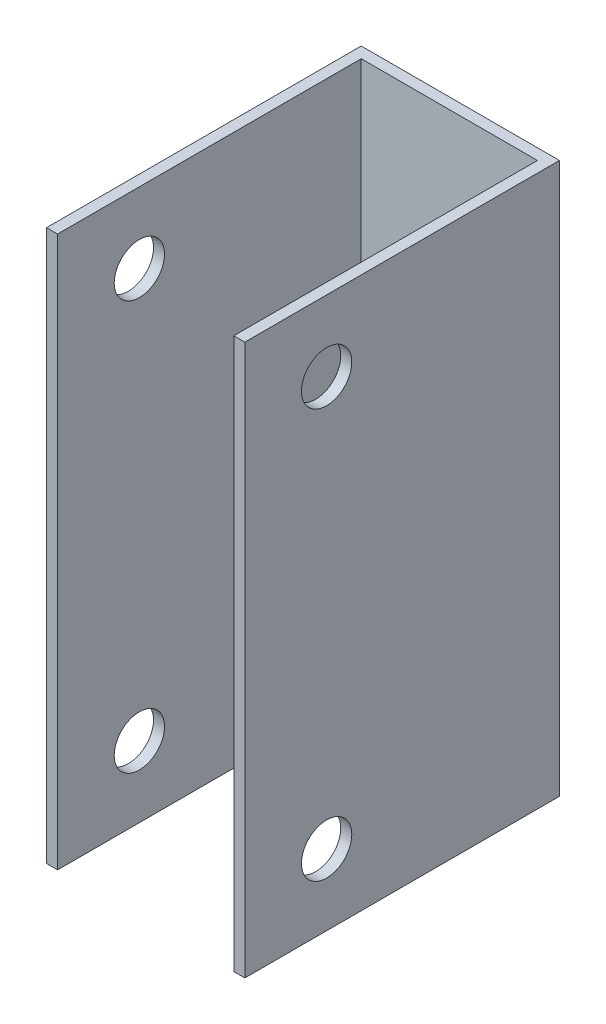
ISO-10303-21;
HEADER;
FILE_DESCRIPTION(('STEP AP214'),'2;1');
FILE_NAME('part.step','',(''),(''),'','','');
FILE_SCHEMA(('AUTOMOTIVE_DESIGN { 1 0 10303 214 1 1 1 1 }'));
ENDSEC;
DATA;
#1=APPLICATION_CONTEXT('core data for automotive mechanical design processes');
#2=APPLICATION_PROTOCOL_DEFINITION('international standard','automotive_design',2000,#1);
#3=PRODUCT_CONTEXT('',#1,'mechanical');
#4=PRODUCT('Part','Part','',(#3));
#5=PRODUCT_RELATED_PRODUCT_CATEGORY('part','',(#4));
#6=PRODUCT_DEFINITION_FORMATION('','',#4);
#7=PRODUCT_DEFINITION_CONTEXT('part definition',#1,'design');
#8=PRODUCT_DEFINITION('design','',#6,#7);
#9=PRODUCT_DEFINITION_SHAPE('','',#8);
#10=(LENGTH_UNIT() NAMED_UNIT(*) SI_UNIT(.MILLI.,.METRE.));
#11=(NAMED_UNIT(*) PLANE_ANGLE_UNIT() SI_UNIT($,.RADIAN.));
#12=(NAMED_UNIT(*) SI_UNIT($,.STERADIAN.) SOLID_ANGLE_UNIT());
#13=UNCERTAINTY_MEASURE_WITH_UNIT(LENGTH_MEASURE(1.E-05),#10,'distance_accuracy_value','');
#14=(GEOMETRIC_REPRESENTATION_CONTEXT(3) GLOBAL_UNCERTAINTY_ASSIGNED_CONTEXT((#13)) GLOBAL_UNIT_ASSIGNED_CONTEXT((#10,
#11,#12)) REPRESENTATION_CONTEXT('',''));
#15=CARTESIAN_POINT('',(0.,0.,0.));
#16=DIRECTION('',(0.,0.,1.));
#17=DIRECTION('',(1.,0.,0.));
#18=AXIS2_PLACEMENT_3D('',#15,#16,#17);
#19=CARTESIAN_POINT('',(0.7,35.,0.));
#20=DIRECTION('',(0.,0.,-1.));
#21=DIRECTION('',(-1.,0.,0.));
#22=AXIS2_PLACEMENT_3D('',#19,#20,#21);
#23=PLANE('',#22);
#24=DIRECTION('',(1.,0.,0.));
#25=VECTOR('',#24,1.);
#26=CARTESIAN_POINT('',(0.7,0.,0.));
#27=LINE('',#26,#25);
#28=CARTESIAN_POINT('',(0.,0.,0.));
#29=VERTEX_POINT('',#28);
#30=CARTESIAN_POINT('',(0.7,0.,0.));
#31=VERTEX_POINT('',#30);
#32=EDGE_CURVE('E130',#29,#31,#27,.T.);
#33=ORIENTED_EDGE('',*,*,#32,.T.);
#34=DIRECTION('',(0.,-1.,0.));
#35=VECTOR('',#34,1.);
#36=CARTESIAN_POINT('',(0.7,35.,0.));
#37=LINE('',#36,#35);
#38=CARTESIAN_POINT('',(0.7,35.,0.));
#39=VERTEX_POINT('',#38);
#40=EDGE_CURVE('E11',#39,#31,#37,.T.);
#41=ORIENTED_EDGE('',*,*,#40,.F.);
#42=DIRECTION('',(1.,0.,0.));
#43=VECTOR('',#42,1.);
#44=CARTESIAN_POINT('',(0.7,35.,0.));
#45=LINE('',#44,#43);
#46=CARTESIAN_POINT('',(0.,35.,0.));
#47=VERTEX_POINT('',#46);
#48=EDGE_CURVE('E146',#47,#39,#45,.T.);
#49=ORIENTED_EDGE('',*,*,#48,.F.);
#50=DIRECTION('',(0.,-1.,0.));
#51=VECTOR('',#50,1.);
#52=CARTESIAN_POINT('',(0.,35.,0.));
#53=LINE('',#52,#51);
#54=EDGE_CURVE('E126',#47,#29,#53,.T.);
#55=ORIENTED_EDGE('',*,*,#54,.T.);
#56=EDGE_LOOP('',(#33,#41,#49,#55));
#57=FACE_BOUND('',#56,.T.);
#58=ADVANCED_FACE('F35',(#57),#23,.F.);
#59=CARTESIAN_POINT('',(0.7,35.,0.));
#60=DIRECTION('',(-1.,0.,0.));
#61=DIRECTION('',(0.,0.,1.));
#62=AXIS2_PLACEMENT_3D('',#59,#60,#61);
#63=PLANE('',#62);
#64=CARTESIAN_POINT('',(0.699999999999998,30.5,-5.2));
#65=DIRECTION('',(-1.,0.,0.));
#66=DIRECTION('',(0.,0.,1.));
#67=AXIS2_PLACEMENT_3D('',#64,#65,#66);
#68=CIRCLE('',#67,1.6);
#69=CARTESIAN_POINT('',(0.699999999999998,30.5,-3.6));
#70=VERTEX_POINT('',#69);
#71=EDGE_CURVE('E134',#70,#70,#68,.T.);
#72=ORIENTED_EDGE('',*,*,#71,.T.);
#73=EDGE_LOOP('',(#72));
#74=FACE_BOUND('',#73,.T.);
#75=CARTESIAN_POINT('',(0.699999999999998,4.5,-5.2));
#76=DIRECTION('',(-1.,0.,0.));
#77=DIRECTION('',(0.,0.,1.));
#78=AXIS2_PLACEMENT_3D('',#75,#76,#77);
#79=CIRCLE('',#78,1.6);
#80=CARTESIAN_POINT('',(0.699999999999998,4.5,-3.6));
#81=VERTEX_POINT('',#80);
#82=EDGE_CURVE('E184',#81,#81,#79,.T.);
#83=ORIENTED_EDGE('',*,*,#82,.T.);
#84=EDGE_LOOP('',(#83));
#85=FACE_BOUND('',#84,.T.);
#86=DIRECTION('',(0.,0.,-1.));
#87=VECTOR('',#86,1.);
#88=CARTESIAN_POINT('',(0.7,0.,0.));
#89=LINE('',#88,#87);
#90=CARTESIAN_POINT('',(0.699999999999995,0.,-19.3));
#91=VERTEX_POINT('',#90);
#92=EDGE_CURVE('E133',#31,#91,#89,.T.);
#93=ORIENTED_EDGE('',*,*,#92,.T.);
#94=DIRECTION('',(0.,-1.,0.));
#95=VECTOR('',#94,1.);
#96=CARTESIAN_POINT('',(0.699999999999995,35.,-19.3));
#97=LINE('',#96,#95);
#98=CARTESIAN_POINT('',(0.699999999999995,35.,-19.3));
#99=VERTEX_POINT('',#98);
#100=EDGE_CURVE('E43',#99,#91,#97,.T.);
#101=ORIENTED_EDGE('',*,*,#100,.F.);
#102=DIRECTION('',(0.,0.,-1.));
#103=VECTOR('',#102,1.);
#104=CARTESIAN_POINT('',(0.7,35.,0.));
#105=LINE('',#104,#103);
#106=EDGE_CURVE('E94',#39,#99,#105,.T.);
#107=ORIENTED_EDGE('',*,*,#106,.F.);
#108=ORIENTED_EDGE('',*,*,#40,.T.);
#109=EDGE_LOOP('',(#93,#101,#107,#108));
#110=FACE_BOUND('',#109,.T.);
#111=ADVANCED_FACE('F231',(#74,#85,#110),#63,.F.);
#112=CARTESIAN_POINT('',(0.699999999999995,35.,-19.3));
#113=DIRECTION('',(0.,0.,-1.));
#114=DIRECTION('',(-1.,0.,0.));
#115=AXIS2_PLACEMENT_3D('',#112,#113,#114);
#116=PLANE('',#115);
#117=DIRECTION('',(1.,0.,0.));
#118=VECTOR('',#117,1.);
#119=CARTESIAN_POINT('',(0.699999999999995,0.,-19.3));
#120=LINE('',#119,#118);
#121=CARTESIAN_POINT('',(11.9,0.,-19.3));
#122=VERTEX_POINT('',#121);
#123=EDGE_CURVE('E136',#91,#122,#120,.T.);
#124=ORIENTED_EDGE('',*,*,#123,.T.);
#125=DIRECTION('',(0.,-1.,0.));
#126=VECTOR('',#125,1.);
#127=CARTESIAN_POINT('',(11.9,35.,-19.3));
#128=LINE('',#127,#126);
#129=CARTESIAN_POINT('',(11.9,35.,-19.3));
#130=VERTEX_POINT('',#129);
#131=EDGE_CURVE('E153',#130,#122,#128,.T.);
#132=ORIENTED_EDGE('',*,*,#131,.F.);
#133=DIRECTION('',(1.,0.,0.));
#134=VECTOR('',#133,1.);
#135=CARTESIAN_POINT('',(0.699999999999995,35.,-19.3));
#136=LINE('',#135,#134);
#137=EDGE_CURVE('E161',#99,#130,#136,.T.);
#138=ORIENTED_EDGE('',*,*,#137,.F.);
#139=ORIENTED_EDGE('',*,*,#100,.T.);
#140=EDGE_LOOP('',(#124,#132,#138,#139));
#141=FACE_BOUND('',#140,.T.);
#142=ADVANCED_FACE('F159',(#141),#116,.F.);
#143=CARTESIAN_POINT('',(11.9,35.,-19.3));
#144=DIRECTION('',(1.,0.,0.));
#145=DIRECTION('',(0.,0.,-1.));
#146=AXIS2_PLACEMENT_3D('',#143,#144,#145);
#147=PLANE('',#146);
#148=CARTESIAN_POINT('',(11.9,30.5,-5.2));
#149=DIRECTION('',(1.,0.,0.));
#150=DIRECTION('',(0.,0.,-1.));
#151=AXIS2_PLACEMENT_3D('',#148,#149,#150);
#152=CIRCLE('',#151,1.6);
#153=CARTESIAN_POINT('',(11.9,30.5,-6.8));
#154=VERTEX_POINT('',#153);
#155=EDGE_CURVE('E181',#154,#154,#152,.T.);
#156=ORIENTED_EDGE('',*,*,#155,.T.);
#157=EDGE_LOOP('',(#156));
#158=FACE_BOUND('',#157,.T.);
#159=CARTESIAN_POINT('',(11.9,4.5,-5.2));
#160=DIRECTION('',(1.,0.,0.));
#161=DIRECTION('',(0.,0.,-1.));
#162=AXIS2_PLACEMENT_3D('',#159,#160,#161);
#163=CIRCLE('',#162,1.6);
#164=CARTESIAN_POINT('',(11.9,4.5,-6.8));
#165=VERTEX_POINT('',#164);
#166=EDGE_CURVE('E187',#165,#165,#163,.T.);
#167=ORIENTED_EDGE('',*,*,#166,.T.);
#168=EDGE_LOOP('',(#167));
#169=FACE_BOUND('',#168,.T.);
#170=DIRECTION('',(0.,0.,1.));
#171=VECTOR('',#170,1.);
#172=CARTESIAN_POINT('',(11.9,0.,-19.3));
#173=LINE('',#172,#171);
#174=CARTESIAN_POINT('',(11.9,0.,0.));
#175=VERTEX_POINT('',#174);
#176=EDGE_CURVE('E138',#122,#175,#173,.T.);
#177=ORIENTED_EDGE('',*,*,#176,.T.);
#178=DIRECTION('',(0.,-1.,0.));
#179=VECTOR('',#178,1.);
#180=CARTESIAN_POINT('',(11.9,35.,0.));
#181=LINE('',#180,#179);
#182=CARTESIAN_POINT('',(11.9,35.,0.));
#183=VERTEX_POINT('',#182);
#184=EDGE_CURVE('E150',#183,#175,#181,.T.);
#185=ORIENTED_EDGE('',*,*,#184,.F.);
#186=DIRECTION('',(0.,0.,1.));
#187=VECTOR('',#186,1.);
#188=CARTESIAN_POINT('',(11.9,35.,-19.3));
#189=LINE('',#188,#187);
#190=EDGE_CURVE('E173',#130,#183,#189,.T.);
#191=ORIENTED_EDGE('',*,*,#190,.F.);
#192=ORIENTED_EDGE('',*,*,#131,.T.);
#193=EDGE_LOOP('',(#177,#185,#191,#192));
#194=FACE_BOUND('',#193,.T.);
#195=ADVANCED_FACE('F169',(#158,#169,#194),#147,.F.);
#196=CARTESIAN_POINT('',(11.9,35.,0.));
#197=DIRECTION('',(0.,0.,-1.));
#198=DIRECTION('',(-1.,0.,0.));
#199=AXIS2_PLACEMENT_3D('',#196,#197,#198);
#200=PLANE('',#199);
#201=DIRECTION('',(1.,0.,0.));
#202=VECTOR('',#201,1.);
#203=CARTESIAN_POINT('',(11.9,0.,0.));
#204=LINE('',#203,#202);
#205=CARTESIAN_POINT('',(12.6,0.,0.));
#206=VERTEX_POINT('',#205);
#207=EDGE_CURVE('E140',#175,#206,#204,.T.);
#208=ORIENTED_EDGE('',*,*,#207,.T.);
#209=DIRECTION('',(0.,-1.,0.));
#210=VECTOR('',#209,1.);
#211=CARTESIAN_POINT('',(12.6,35.,0.));
#212=LINE('',#211,#210);
#213=CARTESIAN_POINT('',(12.6,35.,0.));
#214=VERTEX_POINT('',#213);
#215=EDGE_CURVE('E121',#214,#206,#212,.T.);
#216=ORIENTED_EDGE('',*,*,#215,.F.);
#217=DIRECTION('',(1.,0.,0.));
#218=VECTOR('',#217,1.);
#219=CARTESIAN_POINT('',(11.9,35.,0.));
#220=LINE('',#219,#218);
#221=EDGE_CURVE('E113',#183,#214,#220,.T.);
#222=ORIENTED_EDGE('',*,*,#221,.F.);
#223=ORIENTED_EDGE('',*,*,#184,.T.);
#224=EDGE_LOOP('',(#208,#216,#222,#223));
#225=FACE_BOUND('',#224,.T.);
#226=ADVANCED_FACE('F172',(#225),#200,.F.);
#227=CARTESIAN_POINT('',(12.6,35.,-20.));
#228=DIRECTION('',(-1.,0.,0.));
#229=DIRECTION('',(0.,0.,1.));
#230=AXIS2_PLACEMENT_3D('',#227,#228,#229);
#231=PLANE('',#230);
#232=CARTESIAN_POINT('',(12.6,30.5,-5.2));
#233=DIRECTION('',(-1.,0.,0.));
#234=DIRECTION('',(0.,0.,1.));
#235=AXIS2_PLACEMENT_3D('',#232,#233,#234);
#236=CIRCLE('',#235,1.6);
#237=CARTESIAN_POINT('',(12.6,30.5,-3.6));
#238=VERTEX_POINT('',#237);
#239=EDGE_CURVE('E190',#238,#238,#236,.T.);
#240=ORIENTED_EDGE('',*,*,#239,.T.);
#241=EDGE_LOOP('',(#240));
#242=FACE_BOUND('',#241,.T.);
#243=CARTESIAN_POINT('',(12.6,4.5,-5.2));
#244=DIRECTION('',(-1.,0.,0.));
#245=DIRECTION('',(0.,0.,-1.));
#246=AXIS2_PLACEMENT_3D('',#243,#244,#245);
#247=CIRCLE('',#246,1.6);
#248=CARTESIAN_POINT('',(12.6,4.5,-6.8));
#249=VERTEX_POINT('',#248);
#250=EDGE_CURVE('E194',#249,#249,#247,.T.);
#251=ORIENTED_EDGE('',*,*,#250,.T.);
#252=EDGE_LOOP('',(#251));
#253=FACE_BOUND('',#252,.T.);
#254=DIRECTION('',(0.,0.,-1.));
#255=VECTOR('',#254,1.);
#256=CARTESIAN_POINT('',(12.6,0.,-20.));
#257=LINE('',#256,#255);
#258=CARTESIAN_POINT('',(12.6,0.,-20.));
#259=VERTEX_POINT('',#258);
#260=EDGE_CURVE('E120',#206,#259,#257,.T.);
#261=ORIENTED_EDGE('',*,*,#260,.T.);
#262=DIRECTION('',(0.,-1.,0.));
#263=VECTOR('',#262,1.);
#264=CARTESIAN_POINT('',(12.6,35.,-20.));
#265=LINE('',#264,#263);
#266=CARTESIAN_POINT('',(12.6,35.,-20.));
#267=VERTEX_POINT('',#266);
#268=EDGE_CURVE('E118',#267,#259,#265,.T.);
#269=ORIENTED_EDGE('',*,*,#268,.F.);
#270=DIRECTION('',(0.,0.,-1.));
#271=VECTOR('',#270,1.);
#272=CARTESIAN_POINT('',(12.6,35.,-9.50203011852171));
#273=LINE('',#272,#271);
#274=EDGE_CURVE('E107',#214,#267,#273,.T.);
#275=ORIENTED_EDGE('',*,*,#274,.F.);
#276=ORIENTED_EDGE('',*,*,#215,.T.);
#277=EDGE_LOOP('',(#261,#269,#275,#276));
#278=FACE_BOUND('',#277,.T.);
#279=ADVANCED_FACE('F119',(#242,#253,#278),#231,.F.);
#280=CARTESIAN_POINT('',(0.,35.,-20.));
#281=DIRECTION('',(0.,0.,1.));
#282=DIRECTION('',(1.,0.,0.));
#283=AXIS2_PLACEMENT_3D('',#280,#281,#282);
#284=PLANE('',#283);
#285=DIRECTION('',(-1.,0.,0.));
#286=VECTOR('',#285,1.);
#287=CARTESIAN_POINT('',(0.,0.,-20.));
#288=LINE('',#287,#286);
#289=CARTESIAN_POINT('',(0.,0.,-20.));
#290=VERTEX_POINT('',#289);
#291=EDGE_CURVE('E80',#259,#290,#288,.T.);
#292=ORIENTED_EDGE('',*,*,#291,.T.);
#293=DIRECTION('',(0.,-1.,0.));
#294=VECTOR('',#293,1.);
#295=CARTESIAN_POINT('',(0.,35.,-20.));
#296=LINE('',#295,#294);
#297=CARTESIAN_POINT('',(0.,35.,-20.));
#298=VERTEX_POINT('',#297);
#299=EDGE_CURVE('E122',#298,#290,#296,.T.);
#300=ORIENTED_EDGE('',*,*,#299,.F.);
#301=DIRECTION('',(-1.,0.,0.));
#302=VECTOR('',#301,1.);
#303=CARTESIAN_POINT('',(0.,35.,-20.));
#304=LINE('',#303,#302);
#305=EDGE_CURVE('E111',#267,#298,#304,.T.);
#306=ORIENTED_EDGE('',*,*,#305,.F.);
#307=ORIENTED_EDGE('',*,*,#268,.T.);
#308=EDGE_LOOP('',(#292,#300,#306,#307));
#309=FACE_BOUND('',#308,.T.);
#310=ADVANCED_FACE('F124',(#309),#284,.F.);
#311=CARTESIAN_POINT('',(0.,35.,0.));
#312=DIRECTION('',(1.,0.,0.));
#313=DIRECTION('',(0.,0.,-1.));
#314=AXIS2_PLACEMENT_3D('',#311,#312,#313);
#315=PLANE('',#314);
#316=CARTESIAN_POINT('',(0.,30.5,-5.2));
#317=DIRECTION('',(-1.,0.,0.));
#318=DIRECTION('',(0.,0.,1.));
#319=AXIS2_PLACEMENT_3D('',#316,#317,#318);
#320=CIRCLE('',#319,1.6);
#321=CARTESIAN_POINT('',(0.,30.5,-3.6));
#322=VERTEX_POINT('',#321);
#323=EDGE_CURVE('E197',#322,#322,#320,.T.);
#324=ORIENTED_EDGE('',*,*,#323,.F.);
#325=EDGE_LOOP('',(#324));
#326=FACE_BOUND('',#325,.T.);
#327=CARTESIAN_POINT('',(0.,4.5,-5.2));
#328=DIRECTION('',(-1.,0.,0.));
#329=DIRECTION('',(0.,0.,-1.));
#330=AXIS2_PLACEMENT_3D('',#327,#328,#329);
#331=CIRCLE('',#330,1.6);
#332=CARTESIAN_POINT('',(0.,4.5,-6.8));
#333=VERTEX_POINT('',#332);
#334=EDGE_CURVE('E191',#333,#333,#331,.T.);
#335=ORIENTED_EDGE('',*,*,#334,.F.);
#336=EDGE_LOOP('',(#335));
#337=FACE_BOUND('',#336,.T.);
#338=DIRECTION('',(0.,0.,1.));
#339=VECTOR('',#338,1.);
#340=CARTESIAN_POINT('',(0.,0.,0.));
#341=LINE('',#340,#339);
#342=EDGE_CURVE('E86',#290,#29,#341,.T.);
#343=ORIENTED_EDGE('',*,*,#342,.T.);
#344=ORIENTED_EDGE('',*,*,#54,.F.);
#345=DIRECTION('',(0.,0.,1.));
#346=VECTOR('',#345,1.);
#347=CARTESIAN_POINT('',(0.,35.,0.));
#348=LINE('',#347,#346);
#349=EDGE_CURVE('E51',#298,#47,#348,.T.);
#350=ORIENTED_EDGE('',*,*,#349,.F.);
#351=ORIENTED_EDGE('',*,*,#299,.T.);
#352=EDGE_LOOP('',(#343,#344,#350,#351));
#353=FACE_BOUND('',#352,.T.);
#354=ADVANCED_FACE('F239',(#326,#337,#353),#315,.F.);
#355=CARTESIAN_POINT('',(0.,35.,0.));
#356=DIRECTION('',(0.,-1.,0.));
#357=DIRECTION('',(0.,0.,-1.));
#358=AXIS2_PLACEMENT_3D('',#355,#356,#357);
#359=PLANE('',#358);
#360=ORIENTED_EDGE('',*,*,#48,.T.);
#361=ORIENTED_EDGE('',*,*,#106,.T.);
#362=ORIENTED_EDGE('',*,*,#137,.T.);
#363=ORIENTED_EDGE('',*,*,#190,.T.);
#364=ORIENTED_EDGE('',*,*,#221,.T.);
#365=ORIENTED_EDGE('',*,*,#274,.T.);
#366=ORIENTED_EDGE('',*,*,#305,.T.);
#367=ORIENTED_EDGE('',*,*,#349,.T.);
#368=EDGE_LOOP('',(#360,#361,#362,#363,#364,#365,#366,#367));
#369=FACE_BOUND('',#368,.T.);
#370=ADVANCED_FACE('F109',(#369),#359,.F.);
#371=CARTESIAN_POINT('',(0.,0.,0.));
#372=DIRECTION('',(0.,-1.,0.));
#373=DIRECTION('',(0.,0.,-1.));
#374=AXIS2_PLACEMENT_3D('',#371,#372,#373);
#375=PLANE('',#374);
#376=ORIENTED_EDGE('',*,*,#32,.F.);
#377=ORIENTED_EDGE('',*,*,#342,.F.);
#378=ORIENTED_EDGE('',*,*,#291,.F.);
#379=ORIENTED_EDGE('',*,*,#260,.F.);
#380=ORIENTED_EDGE('',*,*,#207,.F.);
#381=ORIENTED_EDGE('',*,*,#176,.F.);
#382=ORIENTED_EDGE('',*,*,#123,.F.);
#383=ORIENTED_EDGE('',*,*,#92,.F.);
#384=EDGE_LOOP('',(#376,#377,#378,#379,#380,#381,#382,#383));
#385=FACE_BOUND('',#384,.T.);
#386=ADVANCED_FACE('F165',(#385),#375,.T.);
#387=CARTESIAN_POINT('',(12.6,4.5,-5.2));
#388=DIRECTION('',(-1.,0.,0.));
#389=DIRECTION('',(0.,0.,1.));
#390=AXIS2_PLACEMENT_3D('',#387,#388,#389);
#391=CYLINDRICAL_SURFACE('',#390,1.6);
#392=ORIENTED_EDGE('',*,*,#334,.T.);
#393=EDGE_LOOP('',(#392));
#394=FACE_BOUND('',#393,.T.);
#395=ORIENTED_EDGE('',*,*,#82,.F.);
#396=EDGE_LOOP('',(#395));
#397=FACE_BOUND('',#396,.T.);
#398=ADVANCED_FACE('F221',(#394,#397),#391,.F.);
#399=CARTESIAN_POINT('',(12.6,30.5,-5.2));
#400=DIRECTION('',(-1.,0.,0.));
#401=DIRECTION('',(0.,0.,1.));
#402=AXIS2_PLACEMENT_3D('',#399,#400,#401);
#403=CYLINDRICAL_SURFACE('',#402,1.6);
#404=ORIENTED_EDGE('',*,*,#323,.T.);
#405=EDGE_LOOP('',(#404));
#406=FACE_BOUND('',#405,.T.);
#407=ORIENTED_EDGE('',*,*,#71,.F.);
#408=EDGE_LOOP('',(#407));
#409=FACE_BOUND('',#408,.T.);
#410=ADVANCED_FACE('F210',(#406,#409),#403,.F.);
#411=ORIENTED_EDGE('',*,*,#250,.F.);
#412=EDGE_LOOP('',(#411));
#413=FACE_BOUND('',#412,.T.);
#414=ORIENTED_EDGE('',*,*,#166,.F.);
#415=EDGE_LOOP('',(#414));
#416=FACE_BOUND('',#415,.T.);
#417=ADVANCED_FACE('F208',(#413,#416),#391,.F.);
#418=ORIENTED_EDGE('',*,*,#239,.F.);
#419=EDGE_LOOP('',(#418));
#420=FACE_BOUND('',#419,.T.);
#421=ORIENTED_EDGE('',*,*,#155,.F.);
#422=EDGE_LOOP('',(#421));
#423=FACE_BOUND('',#422,.T.);
#424=ADVANCED_FACE('F205',(#420,#423),#403,.F.);
#425=CLOSED_SHELL('',(#58,#111,#142,#195,#226,#279,#310,#354,#370,#386,#398,#410,#417,#424));
#426=MANIFOLD_SOLID_BREP('B2',#425);
#427=ADVANCED_BREP_SHAPE_REPRESENTATION('',(#18,#426),#14);
#428=SHAPE_DEFINITION_REPRESENTATION(#9,#427);
ENDSEC;
END-ISO-10303-21;
